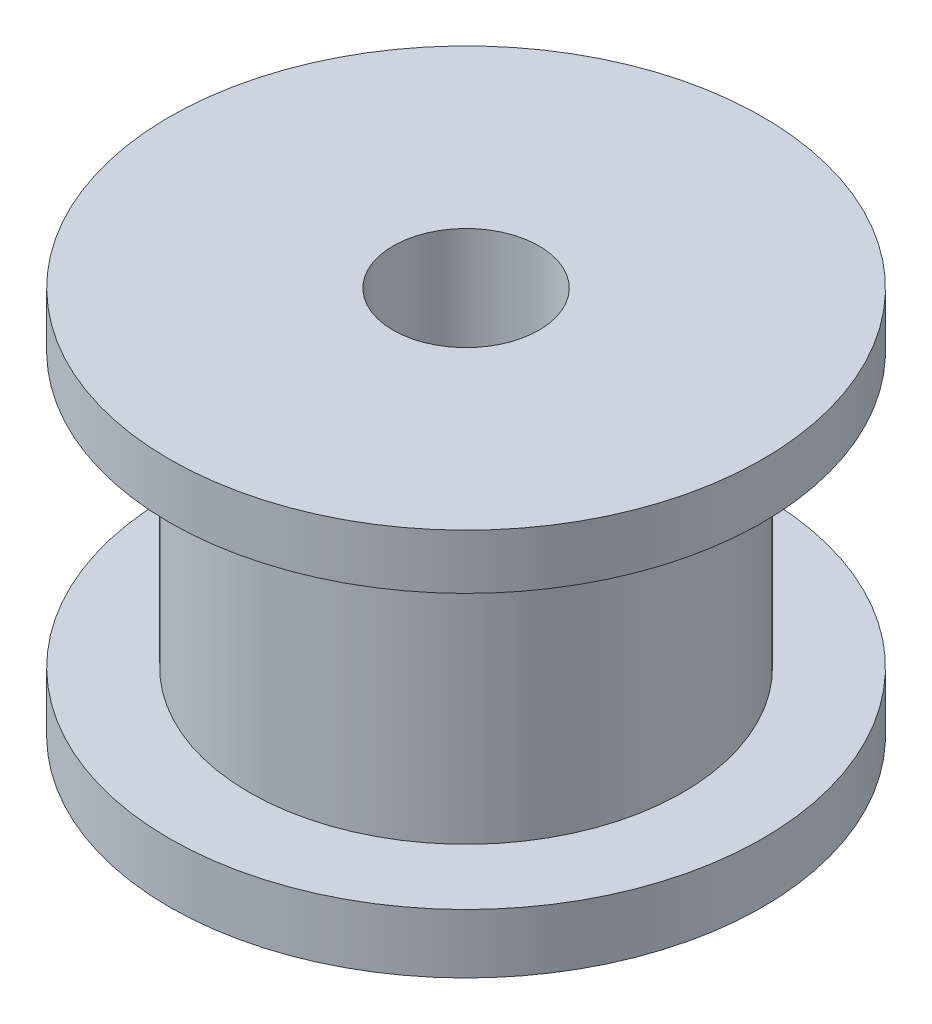
ISO-10303-21;
HEADER;
FILE_DESCRIPTION(('STEP AP214'),'2;1');
FILE_NAME('part.step','',(''),(''),'','','');
FILE_SCHEMA(('AUTOMOTIVE_DESIGN { 1 0 10303 214 1 1 1 1 }'));
ENDSEC;
DATA;
#1=APPLICATION_CONTEXT('core data for automotive mechanical design processes');
#2=APPLICATION_PROTOCOL_DEFINITION('international standard','automotive_design',2000,#1);
#3=PRODUCT_CONTEXT('',#1,'mechanical');
#4=PRODUCT('Part','Part','',(#3));
#5=PRODUCT_RELATED_PRODUCT_CATEGORY('part','',(#4));
#6=PRODUCT_DEFINITION_FORMATION('','',#4);
#7=PRODUCT_DEFINITION_CONTEXT('part definition',#1,'design');
#8=PRODUCT_DEFINITION('design','',#6,#7);
#9=PRODUCT_DEFINITION_SHAPE('','',#8);
#10=(LENGTH_UNIT() NAMED_UNIT(*) SI_UNIT(.MILLI.,.METRE.));
#11=(NAMED_UNIT(*) PLANE_ANGLE_UNIT() SI_UNIT($,.RADIAN.));
#12=(NAMED_UNIT(*) SI_UNIT($,.STERADIAN.) SOLID_ANGLE_UNIT());
#13=UNCERTAINTY_MEASURE_WITH_UNIT(LENGTH_MEASURE(1.E-05),#10,'distance_accuracy_value','');
#14=(GEOMETRIC_REPRESENTATION_CONTEXT(3) GLOBAL_UNCERTAINTY_ASSIGNED_CONTEXT((#13)) GLOBAL_UNIT_ASSIGNED_CONTEXT((#10,
#11,#12)) REPRESENTATION_CONTEXT('',''));
#15=CARTESIAN_POINT('',(0.,0.,0.));
#16=DIRECTION('',(0.,0.,1.));
#17=DIRECTION('',(1.,0.,0.));
#18=AXIS2_PLACEMENT_3D('',#15,#16,#17);
#19=CARTESIAN_POINT('',(0.,0.,0.));
#20=DIRECTION('',(0.,-1.,0.));
#21=DIRECTION('',(0.,0.,-1.));
#22=AXIS2_PLACEMENT_3D('',#19,#20,#21);
#23=PLANE('',#22);
#24=CARTESIAN_POINT('',(0.,0.,0.));
#25=DIRECTION('',(0.,-1.,0.));
#26=DIRECTION('',(0.,0.,-1.));
#27=AXIS2_PLACEMENT_3D('',#24,#25,#26);
#28=CIRCLE('',#27,1.6);
#29=CARTESIAN_POINT('',(0.,0.,-1.6));
#30=VERTEX_POINT('',#29);
#31=EDGE_CURVE('E58',#30,#30,#28,.T.);
#32=ORIENTED_EDGE('',*,*,#31,.F.);
#33=EDGE_LOOP('',(#32));
#34=FACE_BOUND('',#33,.T.);
#35=CARTESIAN_POINT('',(0.,0.,0.));
#36=DIRECTION('',(0.,1.,0.));
#37=DIRECTION('',(0.,0.,1.));
#38=AXIS2_PLACEMENT_3D('',#35,#36,#37);
#39=CIRCLE('',#38,6.5);
#40=CARTESIAN_POINT('',(0.,0.,6.5));
#41=VERTEX_POINT('',#40);
#42=EDGE_CURVE('E10',#41,#41,#39,.T.);
#43=ORIENTED_EDGE('',*,*,#42,.F.);
#44=EDGE_LOOP('',(#43));
#45=FACE_BOUND('',#44,.T.);
#46=ADVANCED_FACE('F33',(#34,#45),#23,.T.);
#47=CARTESIAN_POINT('',(0.,8.5,0.));
#48=DIRECTION('',(0.,1.,0.));
#49=DIRECTION('',(0.,0.,1.));
#50=AXIS2_PLACEMENT_3D('',#47,#48,#49);
#51=CYLINDRICAL_SURFACE('',#50,6.5);
#52=ORIENTED_EDGE('',*,*,#42,.T.);
#53=EDGE_LOOP('',(#52));
#54=FACE_BOUND('',#53,.T.);
#55=CARTESIAN_POINT('',(0.,1.3,0.));
#56=DIRECTION('',(0.,1.,0.));
#57=DIRECTION('',(0.,0.,1.));
#58=AXIS2_PLACEMENT_3D('',#55,#56,#57);
#59=CIRCLE('',#58,6.5);
#60=CARTESIAN_POINT('',(0.,1.3,6.5));
#61=VERTEX_POINT('',#60);
#62=EDGE_CURVE('E39',#61,#61,#59,.T.);
#63=ORIENTED_EDGE('',*,*,#62,.F.);
#64=EDGE_LOOP('',(#63));
#65=FACE_BOUND('',#64,.T.);
#66=ADVANCED_FACE('F85',(#54,#65),#51,.T.);
#67=CARTESIAN_POINT('',(-6.5,1.3,0.));
#68=DIRECTION('',(0.,1.,0.));
#69=DIRECTION('',(0.,0.,1.));
#70=AXIS2_PLACEMENT_3D('',#67,#68,#69);
#71=PLANE('',#70);
#72=ORIENTED_EDGE('',*,*,#62,.T.);
#73=EDGE_LOOP('',(#72));
#74=FACE_BOUND('',#73,.T.);
#75=CARTESIAN_POINT('',(0.,1.3,0.));
#76=DIRECTION('',(0.,1.,0.));
#77=DIRECTION('',(0.,0.,1.));
#78=AXIS2_PLACEMENT_3D('',#75,#76,#77);
#79=CIRCLE('',#78,4.75);
#80=CARTESIAN_POINT('',(0.,1.3,4.75));
#81=VERTEX_POINT('',#80);
#82=EDGE_CURVE('E43',#81,#81,#79,.T.);
#83=ORIENTED_EDGE('',*,*,#82,.F.);
#84=EDGE_LOOP('',(#83));
#85=FACE_BOUND('',#84,.T.);
#86=ADVANCED_FACE('F90',(#74,#85),#71,.T.);
#87=CARTESIAN_POINT('',(0.,8.5,0.));
#88=DIRECTION('',(0.,1.,0.));
#89=DIRECTION('',(0.,0.,1.));
#90=AXIS2_PLACEMENT_3D('',#87,#88,#89);
#91=CYLINDRICAL_SURFACE('',#90,4.75);
#92=ORIENTED_EDGE('',*,*,#82,.T.);
#93=EDGE_LOOP('',(#92));
#94=FACE_BOUND('',#93,.T.);
#95=CARTESIAN_POINT('',(0.,7.3,0.));
#96=DIRECTION('',(0.,1.,0.));
#97=DIRECTION('',(0.,0.,1.));
#98=AXIS2_PLACEMENT_3D('',#95,#96,#97);
#99=CIRCLE('',#98,4.75);
#100=CARTESIAN_POINT('',(0.,7.3,4.75));
#101=VERTEX_POINT('',#100);
#102=EDGE_CURVE('E47',#101,#101,#99,.T.);
#103=ORIENTED_EDGE('',*,*,#102,.F.);
#104=EDGE_LOOP('',(#103));
#105=FACE_BOUND('',#104,.T.);
#106=ADVANCED_FACE('F81',(#94,#105),#91,.T.);
#107=CARTESIAN_POINT('',(-4.75,7.3,0.));
#108=DIRECTION('',(0.,-1.,0.));
#109=DIRECTION('',(0.,0.,-1.));
#110=AXIS2_PLACEMENT_3D('',#107,#108,#109);
#111=PLANE('',#110);
#112=ORIENTED_EDGE('',*,*,#102,.T.);
#113=EDGE_LOOP('',(#112));
#114=FACE_BOUND('',#113,.T.);
#115=CARTESIAN_POINT('',(0.,7.3,0.));
#116=DIRECTION('',(0.,1.,0.));
#117=DIRECTION('',(0.,0.,1.));
#118=AXIS2_PLACEMENT_3D('',#115,#116,#117);
#119=CIRCLE('',#118,6.5);
#120=CARTESIAN_POINT('',(0.,7.3,6.5));
#121=VERTEX_POINT('',#120);
#122=EDGE_CURVE('E52',#121,#121,#119,.T.);
#123=ORIENTED_EDGE('',*,*,#122,.F.);
#124=EDGE_LOOP('',(#123));
#125=FACE_BOUND('',#124,.T.);
#126=ADVANCED_FACE('F75',(#114,#125),#111,.T.);
#127=CARTESIAN_POINT('',(0.,8.5,0.));
#128=DIRECTION('',(0.,1.,0.));
#129=DIRECTION('',(0.,0.,1.));
#130=AXIS2_PLACEMENT_3D('',#127,#128,#129);
#131=CYLINDRICAL_SURFACE('',#130,6.5);
#132=ORIENTED_EDGE('',*,*,#122,.T.);
#133=EDGE_LOOP('',(#132));
#134=FACE_BOUND('',#133,.T.);
#135=CARTESIAN_POINT('',(0.,8.5,0.));
#136=DIRECTION('',(0.,1.,0.));
#137=DIRECTION('',(0.,0.,1.));
#138=AXIS2_PLACEMENT_3D('',#135,#136,#137);
#139=CIRCLE('',#138,6.5);
#140=CARTESIAN_POINT('',(0.,8.5,6.5));
#141=VERTEX_POINT('',#140);
#142=EDGE_CURVE('E55',#141,#141,#139,.T.);
#143=ORIENTED_EDGE('',*,*,#142,.F.);
#144=EDGE_LOOP('',(#143));
#145=FACE_BOUND('',#144,.T.);
#146=ADVANCED_FACE('F70',(#134,#145),#131,.T.);
#147=CARTESIAN_POINT('',(-6.5,8.5,0.));
#148=DIRECTION('',(0.,1.,0.));
#149=DIRECTION('',(0.,0.,1.));
#150=AXIS2_PLACEMENT_3D('',#147,#148,#149);
#151=PLANE('',#150);
#152=CARTESIAN_POINT('',(0.,8.5,0.));
#153=DIRECTION('',(0.,1.,0.));
#154=DIRECTION('',(0.,0.,1.));
#155=AXIS2_PLACEMENT_3D('',#152,#153,#154);
#156=CIRCLE('',#155,1.6);
#157=CARTESIAN_POINT('',(0.,8.5,1.6));
#158=VERTEX_POINT('',#157);
#159=EDGE_CURVE('E61',#158,#158,#156,.T.);
#160=ORIENTED_EDGE('',*,*,#159,.F.);
#161=EDGE_LOOP('',(#160));
#162=FACE_BOUND('',#161,.T.);
#163=ORIENTED_EDGE('',*,*,#142,.T.);
#164=EDGE_LOOP('',(#163));
#165=FACE_BOUND('',#164,.T.);
#166=ADVANCED_FACE('F67',(#162,#165),#151,.T.);
#167=CARTESIAN_POINT('',(0.,-1.5,0.));
#168=DIRECTION('',(0.,1.,0.));
#169=DIRECTION('',(0.,0.,1.));
#170=AXIS2_PLACEMENT_3D('',#167,#168,#169);
#171=CYLINDRICAL_SURFACE('',#170,1.6);
#172=ORIENTED_EDGE('',*,*,#31,.T.);
#173=EDGE_LOOP('',(#172));
#174=FACE_BOUND('',#173,.T.);
#175=ORIENTED_EDGE('',*,*,#159,.T.);
#176=EDGE_LOOP('',(#175));
#177=FACE_BOUND('',#176,.T.);
#178=ADVANCED_FACE('F65',(#174,#177),#171,.F.);
#179=CLOSED_SHELL('',(#46,#66,#86,#106,#126,#146,#166,#178));
#180=MANIFOLD_SOLID_BREP('B2',#179);
#181=ADVANCED_BREP_SHAPE_REPRESENTATION('',(#18,#180),#14);
#182=SHAPE_DEFINITION_REPRESENTATION(#9,#181);
ENDSEC;
END-ISO-10303-21;
